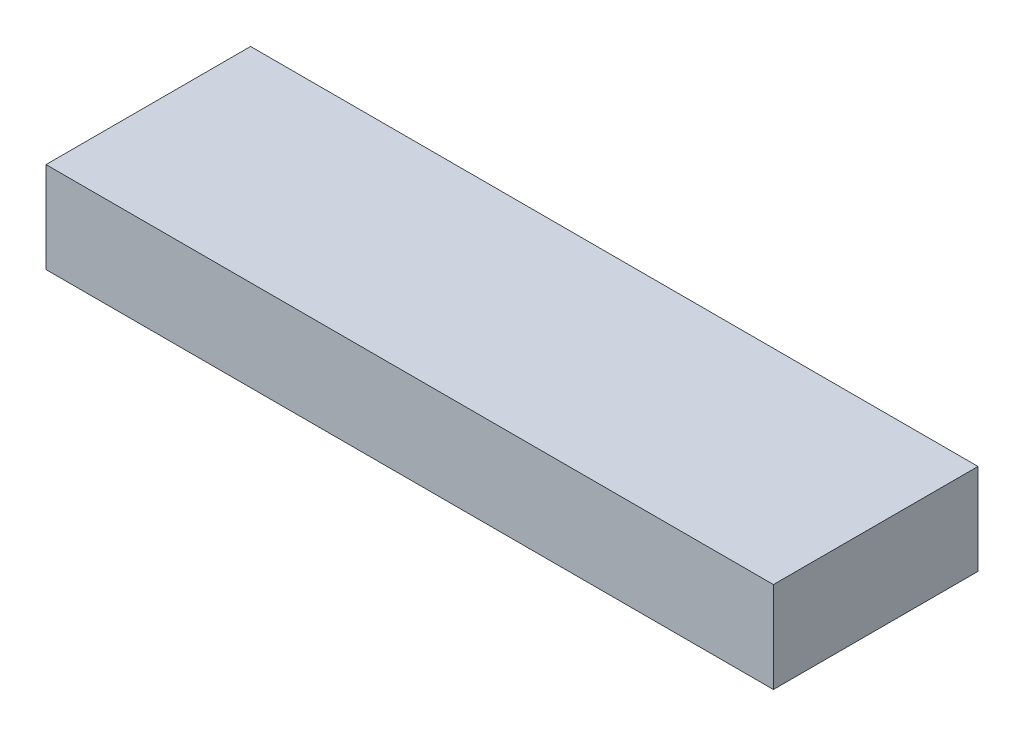
ISO-10303-21;
HEADER;
FILE_DESCRIPTION(('STEP AP214'),'2;1');
FILE_NAME('part.step','',(''),(''),'','','');
FILE_SCHEMA(('AUTOMOTIVE_DESIGN { 1 0 10303 214 1 1 1 1 }'));
ENDSEC;
DATA;
#1=APPLICATION_CONTEXT('core data for automotive mechanical design processes');
#2=APPLICATION_PROTOCOL_DEFINITION('international standard','automotive_design',2000,#1);
#3=PRODUCT_CONTEXT('',#1,'mechanical');
#4=PRODUCT('Part','Part','',(#3));
#5=PRODUCT_RELATED_PRODUCT_CATEGORY('part','',(#4));
#6=PRODUCT_DEFINITION_FORMATION('','',#4);
#7=PRODUCT_DEFINITION_CONTEXT('part definition',#1,'design');
#8=PRODUCT_DEFINITION('design','',#6,#7);
#9=PRODUCT_DEFINITION_SHAPE('','',#8);
#10=(LENGTH_UNIT() NAMED_UNIT(*) SI_UNIT(.MILLI.,.METRE.));
#11=(NAMED_UNIT(*) PLANE_ANGLE_UNIT() SI_UNIT($,.RADIAN.));
#12=(NAMED_UNIT(*) SI_UNIT($,.STERADIAN.) SOLID_ANGLE_UNIT());
#13=UNCERTAINTY_MEASURE_WITH_UNIT(LENGTH_MEASURE(1.E-05),#10,'distance_accuracy_value','');
#14=(GEOMETRIC_REPRESENTATION_CONTEXT(3) GLOBAL_UNCERTAINTY_ASSIGNED_CONTEXT((#13)) GLOBAL_UNIT_ASSIGNED_CONTEXT((#10,
#11,#12)) REPRESENTATION_CONTEXT('',''));
#15=CARTESIAN_POINT('',(0.,0.,0.));
#16=DIRECTION('',(0.,0.,1.));
#17=DIRECTION('',(1.,0.,0.));
#18=AXIS2_PLACEMENT_3D('',#15,#16,#17);
#19=CARTESIAN_POINT('',(-228.088766336441,-450.85,-28.575));
#20=DIRECTION('',(1.,0.,0.));
#21=DIRECTION('',(0.,0.,1.));
#22=AXIS2_PLACEMENT_3D('',#19,#20,#21);
#23=PLANE('',#22);
#24=DIRECTION('',(0.,-1.,0.));
#25=VECTOR('',#24,1.);
#26=CARTESIAN_POINT('',(-228.088766336441,-450.85,0.));
#27=LINE('',#26,#25);
#28=CARTESIAN_POINT('',(-228.088766336441,-450.85,0.));
#29=VERTEX_POINT('',#28);
#30=CARTESIAN_POINT('',(-228.088766336441,-463.55,0.));
#31=VERTEX_POINT('',#30);
#32=EDGE_CURVE('E100',#29,#31,#27,.T.);
#33=ORIENTED_EDGE('',*,*,#32,.F.);
#34=DIRECTION('',(0.,0.,1.));
#35=VECTOR('',#34,1.);
#36=CARTESIAN_POINT('',(-228.088766336441,-450.85,-28.575));
#37=LINE('',#36,#35);
#38=CARTESIAN_POINT('',(-228.088766336441,-450.85,-28.575));
#39=VERTEX_POINT('',#38);
#40=EDGE_CURVE('E99',#39,#29,#37,.T.);
#41=ORIENTED_EDGE('',*,*,#40,.F.);
#42=DIRECTION('',(0.,-1.,0.));
#43=VECTOR('',#42,1.);
#44=CARTESIAN_POINT('',(-228.088766336441,-450.85,-28.575));
#45=LINE('',#44,#43);
#46=CARTESIAN_POINT('',(-228.088766336441,-463.55,-28.575));
#47=VERTEX_POINT('',#46);
#48=EDGE_CURVE('E94',#39,#47,#45,.T.);
#49=ORIENTED_EDGE('',*,*,#48,.T.);
#50=DIRECTION('',(0.,0.,1.));
#51=VECTOR('',#50,1.);
#52=CARTESIAN_POINT('',(-228.088766336441,-463.55,-28.575));
#53=LINE('',#52,#51);
#54=EDGE_CURVE('E11',#47,#31,#53,.T.);
#55=ORIENTED_EDGE('',*,*,#54,.T.);
#56=EDGE_LOOP('',(#33,#41,#49,#55));
#57=FACE_BOUND('',#56,.T.);
#58=ADVANCED_FACE('F37',(#57),#23,.F.);
#59=CARTESIAN_POINT('',(-228.088766336441,-463.55,-28.575));
#60=DIRECTION('',(0.,1.,0.));
#61=DIRECTION('',(0.,0.,-1.));
#62=AXIS2_PLACEMENT_3D('',#59,#60,#61);
#63=PLANE('',#62);
#64=DIRECTION('',(1.,0.,0.));
#65=VECTOR('',#64,1.);
#66=CARTESIAN_POINT('',(-228.088766336441,-463.55,0.));
#67=LINE('',#66,#65);
#68=CARTESIAN_POINT('',(-126.488766336441,-463.55,0.));
#69=VERTEX_POINT('',#68);
#70=EDGE_CURVE('E102',#31,#69,#67,.T.);
#71=ORIENTED_EDGE('',*,*,#70,.F.);
#72=ORIENTED_EDGE('',*,*,#54,.F.);
#73=DIRECTION('',(1.,0.,0.));
#74=VECTOR('',#73,1.);
#75=CARTESIAN_POINT('',(-228.088766336441,-463.55,-28.575));
#76=LINE('',#75,#74);
#77=CARTESIAN_POINT('',(-126.488766336441,-463.55,-28.575));
#78=VERTEX_POINT('',#77);
#79=EDGE_CURVE('E78',#47,#78,#76,.T.);
#80=ORIENTED_EDGE('',*,*,#79,.T.);
#81=DIRECTION('',(0.,0.,1.));
#82=VECTOR('',#81,1.);
#83=CARTESIAN_POINT('',(-126.488766336441,-463.55,-28.575));
#84=LINE('',#83,#82);
#85=EDGE_CURVE('E45',#78,#69,#84,.T.);
#86=ORIENTED_EDGE('',*,*,#85,.T.);
#87=EDGE_LOOP('',(#71,#72,#80,#86));
#88=FACE_BOUND('',#87,.T.);
#89=ADVANCED_FACE('F92',(#88),#63,.F.);
#90=CARTESIAN_POINT('',(-126.488766336441,-450.85,-28.575));
#91=DIRECTION('',(1.,0.,0.));
#92=DIRECTION('',(0.,0.,1.));
#93=AXIS2_PLACEMENT_3D('',#90,#91,#92);
#94=PLANE('',#93);
#95=DIRECTION('',(0.,-1.,0.));
#96=VECTOR('',#95,1.);
#97=CARTESIAN_POINT('',(-126.488766336441,-450.85,0.));
#98=LINE('',#97,#96);
#99=CARTESIAN_POINT('',(-126.488766336441,-450.85,0.));
#100=VERTEX_POINT('',#99);
#101=EDGE_CURVE('E88',#100,#69,#98,.T.);
#102=ORIENTED_EDGE('',*,*,#101,.T.);
#103=ORIENTED_EDGE('',*,*,#85,.F.);
#104=DIRECTION('',(0.,-1.,0.));
#105=VECTOR('',#104,1.);
#106=CARTESIAN_POINT('',(-126.488766336441,-450.85,-28.575));
#107=LINE('',#106,#105);
#108=CARTESIAN_POINT('',(-126.488766336441,-450.85,-28.575));
#109=VERTEX_POINT('',#108);
#110=EDGE_CURVE('E81',#109,#78,#107,.T.);
#111=ORIENTED_EDGE('',*,*,#110,.F.);
#112=DIRECTION('',(0.,0.,1.));
#113=VECTOR('',#112,1.);
#114=CARTESIAN_POINT('',(-126.488766336441,-450.85,-28.575));
#115=LINE('',#114,#113);
#116=EDGE_CURVE('E91',#109,#100,#115,.T.);
#117=ORIENTED_EDGE('',*,*,#116,.T.);
#118=EDGE_LOOP('',(#102,#103,#111,#117));
#119=FACE_BOUND('',#118,.T.);
#120=ADVANCED_FACE('F87',(#119),#94,.T.);
#121=CARTESIAN_POINT('',(-228.088766336441,-450.85,-28.575));
#122=DIRECTION('',(0.,1.,0.));
#123=DIRECTION('',(0.,0.,-1.));
#124=AXIS2_PLACEMENT_3D('',#121,#122,#123);
#125=PLANE('',#124);
#126=DIRECTION('',(1.,0.,0.));
#127=VECTOR('',#126,1.);
#128=CARTESIAN_POINT('',(-228.088766336441,-450.85,0.));
#129=LINE('',#128,#127);
#130=EDGE_CURVE('E67',#29,#100,#129,.T.);
#131=ORIENTED_EDGE('',*,*,#130,.T.);
#132=ORIENTED_EDGE('',*,*,#116,.F.);
#133=DIRECTION('',(1.,0.,0.));
#134=VECTOR('',#133,1.);
#135=CARTESIAN_POINT('',(-228.088766336441,-450.85,-28.575));
#136=LINE('',#135,#134);
#137=EDGE_CURVE('E53',#39,#109,#136,.T.);
#138=ORIENTED_EDGE('',*,*,#137,.F.);
#139=ORIENTED_EDGE('',*,*,#40,.T.);
#140=EDGE_LOOP('',(#131,#132,#138,#139));
#141=FACE_BOUND('',#140,.T.);
#142=ADVANCED_FACE('F111',(#141),#125,.T.);
#143=CARTESIAN_POINT('',(0.,0.,-28.575));
#144=DIRECTION('',(0.,0.,-1.));
#145=DIRECTION('',(1.,0.,0.));
#146=AXIS2_PLACEMENT_3D('',#143,#144,#145);
#147=PLANE('',#146);
#148=ORIENTED_EDGE('',*,*,#48,.F.);
#149=ORIENTED_EDGE('',*,*,#137,.T.);
#150=ORIENTED_EDGE('',*,*,#110,.T.);
#151=ORIENTED_EDGE('',*,*,#79,.F.);
#152=EDGE_LOOP('',(#148,#149,#150,#151));
#153=FACE_BOUND('',#152,.T.);
#154=ADVANCED_FACE('F83',(#153),#147,.T.);
#155=CARTESIAN_POINT('',(0.,0.,0.));
#156=DIRECTION('',(0.,0.,-1.));
#157=DIRECTION('',(1.,0.,0.));
#158=AXIS2_PLACEMENT_3D('',#155,#156,#157);
#159=PLANE('',#158);
#160=ORIENTED_EDGE('',*,*,#32,.T.);
#161=ORIENTED_EDGE('',*,*,#70,.T.);
#162=ORIENTED_EDGE('',*,*,#101,.F.);
#163=ORIENTED_EDGE('',*,*,#130,.F.);
#164=EDGE_LOOP('',(#160,#161,#162,#163));
#165=FACE_BOUND('',#164,.T.);
#166=ADVANCED_FACE('F107',(#165),#159,.F.);
#167=CLOSED_SHELL('',(#58,#89,#120,#142,#154,#166));
#168=MANIFOLD_SOLID_BREP('B2',#167);
#169=ADVANCED_BREP_SHAPE_REPRESENTATION('',(#18,#168),#14);
#170=SHAPE_DEFINITION_REPRESENTATION(#9,#169);
ENDSEC;
END-ISO-10303-21;
